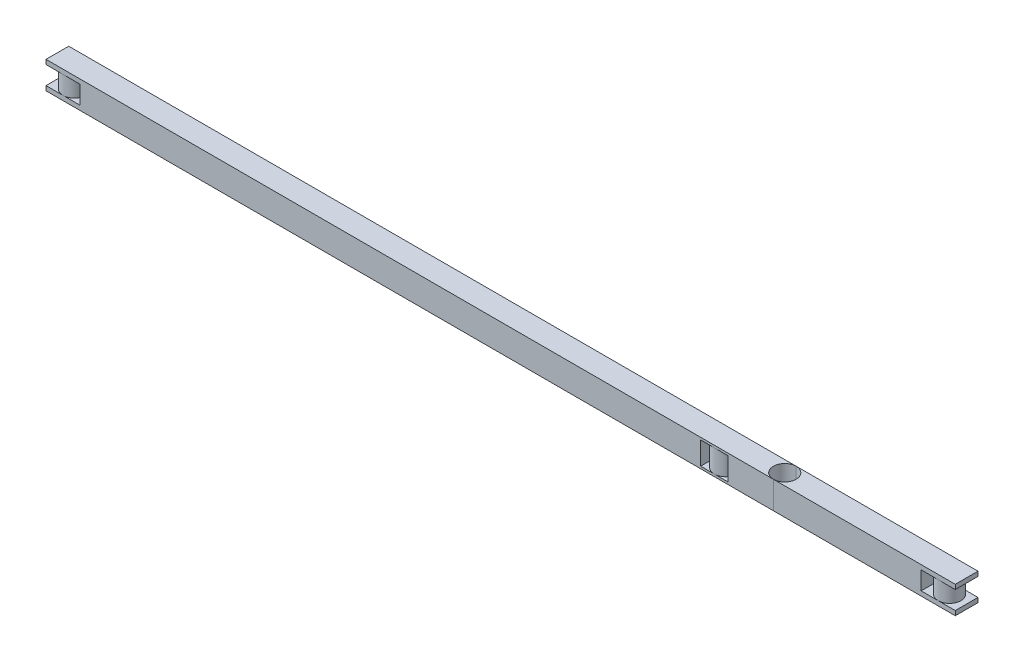
ISO-10303-21;
HEADER;
FILE_DESCRIPTION(('STEP AP214'),'2;1');
FILE_NAME('part.step','',(''),(''),'','','');
FILE_SCHEMA(('AUTOMOTIVE_DESIGN { 1 0 10303 214 1 1 1 1 }'));
ENDSEC;
DATA;
#1=APPLICATION_CONTEXT('core data for automotive mechanical design processes');
#2=APPLICATION_PROTOCOL_DEFINITION('international standard','automotive_design',2000,#1);
#3=PRODUCT_CONTEXT('',#1,'mechanical');
#4=PRODUCT('Part','Part','',(#3));
#5=PRODUCT_RELATED_PRODUCT_CATEGORY('part','',(#4));
#6=PRODUCT_DEFINITION_FORMATION('','',#4);
#7=PRODUCT_DEFINITION_CONTEXT('part definition',#1,'design');
#8=PRODUCT_DEFINITION('design','',#6,#7);
#9=PRODUCT_DEFINITION_SHAPE('','',#8);
#10=(LENGTH_UNIT() NAMED_UNIT(*) SI_UNIT(.MILLI.,.METRE.));
#11=(NAMED_UNIT(*) PLANE_ANGLE_UNIT() SI_UNIT($,.RADIAN.));
#12=(NAMED_UNIT(*) SI_UNIT($,.STERADIAN.) SOLID_ANGLE_UNIT());
#13=UNCERTAINTY_MEASURE_WITH_UNIT(LENGTH_MEASURE(1.E-05),#10,'distance_accuracy_value','');
#14=(GEOMETRIC_REPRESENTATION_CONTEXT(3) GLOBAL_UNCERTAINTY_ASSIGNED_CONTEXT((#13)) GLOBAL_UNIT_ASSIGNED_CONTEXT((#10,
#11,#12)) REPRESENTATION_CONTEXT('',''));
#15=CARTESIAN_POINT('',(0.,0.,0.));
#16=DIRECTION('',(0.,0.,1.));
#17=DIRECTION('',(1.,0.,0.));
#18=AXIS2_PLACEMENT_3D('',#15,#16,#17);
#19=CARTESIAN_POINT('',(0.,0.,5.));
#20=DIRECTION('',(0.,0.,1.));
#21=DIRECTION('',(1.,0.,0.));
#22=AXIS2_PLACEMENT_3D('',#19,#20,#21);
#23=PLANE('',#22);
#24=DIRECTION('',(0.,1.,0.));
#25=VECTOR('',#24,1.);
#26=CARTESIAN_POINT('',(150.,0.,5.));
#27=LINE('',#26,#25);
#28=CARTESIAN_POINT('',(150.,-5.5,5.));
#29=VERTEX_POINT('',#28);
#30=CARTESIAN_POINT('',(150.,-0.5,5.));
#31=VERTEX_POINT('',#30);
#32=EDGE_CURVE('E255',#29,#31,#27,.T.);
#33=ORIENTED_EDGE('',*,*,#32,.F.);
#34=DIRECTION('',(-1.,0.,0.));
#35=VECTOR('',#34,1.);
#36=CARTESIAN_POINT('',(0.,-5.5,5.));
#37=LINE('',#36,#35);
#38=CARTESIAN_POINT('',(147.,-5.5,5.));
#39=VERTEX_POINT('',#38);
#40=EDGE_CURVE('E262',#29,#39,#37,.T.);
#41=ORIENTED_EDGE('',*,*,#40,.T.);
#42=CARTESIAN_POINT('',(144.,-5.5,5.));
#43=VERTEX_POINT('',#42);
#44=EDGE_CURVE('E175',#39,#43,#37,.T.);
#45=ORIENTED_EDGE('',*,*,#44,.T.);
#46=DIRECTION('',(0.,-1.,0.));
#47=VECTOR('',#46,1.);
#48=CARTESIAN_POINT('',(144.,0.,5.));
#49=LINE('',#48,#47);
#50=CARTESIAN_POINT('',(144.,-0.5,5.));
#51=VERTEX_POINT('',#50);
#52=EDGE_CURVE('E259',#51,#43,#49,.T.);
#53=ORIENTED_EDGE('',*,*,#52,.F.);
#54=DIRECTION('',(-1.,0.,0.));
#55=VECTOR('',#54,1.);
#56=CARTESIAN_POINT('',(0.,-0.5,5.));
#57=LINE('',#56,#55);
#58=CARTESIAN_POINT('',(147.,-0.5,5.));
#59=VERTEX_POINT('',#58);
#60=EDGE_CURVE('E265',#59,#51,#57,.T.);
#61=ORIENTED_EDGE('',*,*,#60,.F.);
#62=EDGE_CURVE('E167',#31,#59,#57,.T.);
#63=ORIENTED_EDGE('',*,*,#62,.F.);
#64=EDGE_LOOP('',(#33,#41,#45,#53,#61,#63));
#65=FACE_BOUND('',#64,.T.);
#66=DIRECTION('',(-1.,0.,0.));
#67=VECTOR('',#66,1.);
#68=CARTESIAN_POINT('',(0.,-5.99999999999998,5.));
#69=LINE('',#68,#67);
#70=CARTESIAN_POINT('',(160.,-6.00000000000002,5.));
#71=VERTEX_POINT('',#70);
#72=CARTESIAN_POINT('',(0.,-5.99999999999998,5.));
#73=VERTEX_POINT('',#72);
#74=EDGE_CURVE('E207',#71,#73,#69,.T.);
#75=ORIENTED_EDGE('',*,*,#74,.F.);
#76=DIRECTION('',(0.,1.,0.));
#77=VECTOR('',#76,1.);
#78=CARTESIAN_POINT('',(160.,-6.00000000000004,5.));
#79=LINE('',#78,#77);
#80=CARTESIAN_POINT('',(160.,0.,5.));
#81=VERTEX_POINT('',#80);
#82=EDGE_CURVE('E69',#71,#81,#79,.T.);
#83=ORIENTED_EDGE('',*,*,#82,.T.);
#84=DIRECTION('',(1.,0.,0.));
#85=VECTOR('',#84,1.);
#86=CARTESIAN_POINT('',(0.,0.,5.));
#87=LINE('',#86,#85);
#88=CARTESIAN_POINT('',(0.,0.,5.));
#89=VERTEX_POINT('',#88);
#90=EDGE_CURVE('E210',#89,#81,#87,.T.);
#91=ORIENTED_EDGE('',*,*,#90,.F.);
#92=DIRECTION('',(0.,1.,0.));
#93=VECTOR('',#92,1.);
#94=CARTESIAN_POINT('',(0.,0.,5.));
#95=LINE('',#94,#93);
#96=CARTESIAN_POINT('',(0.,-1.,5.));
#97=VERTEX_POINT('',#96);
#98=EDGE_CURVE('E213',#97,#89,#95,.T.);
#99=ORIENTED_EDGE('',*,*,#98,.F.);
#100=DIRECTION('',(1.,0.,0.));
#101=VECTOR('',#100,1.);
#102=CARTESIAN_POINT('',(0.,-1.,5.));
#103=LINE('',#102,#101);
#104=CARTESIAN_POINT('',(3.75,-1.,5.));
#105=VERTEX_POINT('',#104);
#106=EDGE_CURVE('E203',#97,#105,#103,.T.);
#107=ORIENTED_EDGE('',*,*,#106,.T.);
#108=CARTESIAN_POINT('',(7.5,-1.,5.));
#109=VERTEX_POINT('',#108);
#110=EDGE_CURVE('E238',#105,#109,#103,.T.);
#111=ORIENTED_EDGE('',*,*,#110,.T.);
#112=DIRECTION('',(0.,-1.,0.));
#113=VECTOR('',#112,1.);
#114=CARTESIAN_POINT('',(7.5,0.,5.));
#115=LINE('',#114,#113);
#116=CARTESIAN_POINT('',(7.5,-4.99999999999998,5.));
#117=VERTEX_POINT('',#116);
#118=EDGE_CURVE('E236',#109,#117,#115,.T.);
#119=ORIENTED_EDGE('',*,*,#118,.T.);
#120=DIRECTION('',(-1.,0.,0.));
#121=VECTOR('',#120,1.);
#122=CARTESIAN_POINT('',(0.,-4.99999999999998,5.));
#123=LINE('',#122,#121);
#124=CARTESIAN_POINT('',(3.75,-4.99999999999998,5.));
#125=VERTEX_POINT('',#124);
#126=EDGE_CURVE('E232',#117,#125,#123,.T.);
#127=ORIENTED_EDGE('',*,*,#126,.T.);
#128=CARTESIAN_POINT('',(0.,-4.99999999999998,5.));
#129=VERTEX_POINT('',#128);
#130=EDGE_CURVE('E235',#125,#129,#123,.T.);
#131=ORIENTED_EDGE('',*,*,#130,.T.);
#132=EDGE_CURVE('E244',#73,#129,#95,.T.);
#133=ORIENTED_EDGE('',*,*,#132,.F.);
#134=EDGE_LOOP('',(#75,#83,#91,#99,#107,#111,#119,#127,#131,#133));
#135=FACE_BOUND('',#134,.T.);
#136=ADVANCED_FACE('F53',(#65,#135),#23,.T.);
#137=CARTESIAN_POINT('',(0.,0.,0.));
#138=DIRECTION('',(0.,0.,1.));
#139=DIRECTION('',(1.,0.,0.));
#140=AXIS2_PLACEMENT_3D('',#137,#138,#139);
#141=PLANE('',#140);
#142=DIRECTION('',(-1.,0.,0.));
#143=VECTOR('',#142,1.);
#144=CARTESIAN_POINT('',(150.,-5.5,0.));
#145=LINE('',#144,#143);
#146=CARTESIAN_POINT('',(150.,-5.5,0.));
#147=VERTEX_POINT('',#146);
#148=CARTESIAN_POINT('',(147.,-5.5,0.));
#149=VERTEX_POINT('',#148);
#150=EDGE_CURVE('E184',#147,#149,#145,.T.);
#151=ORIENTED_EDGE('',*,*,#150,.F.);
#152=DIRECTION('',(0.,1.,0.));
#153=VECTOR('',#152,1.);
#154=CARTESIAN_POINT('',(150.,-5.5,0.));
#155=LINE('',#154,#153);
#156=CARTESIAN_POINT('',(150.,-0.5,0.));
#157=VERTEX_POINT('',#156);
#158=EDGE_CURVE('E267',#147,#157,#155,.T.);
#159=ORIENTED_EDGE('',*,*,#158,.T.);
#160=DIRECTION('',(-1.,0.,0.));
#161=VECTOR('',#160,1.);
#162=CARTESIAN_POINT('',(150.,-0.5,0.));
#163=LINE('',#162,#161);
#164=CARTESIAN_POINT('',(147.,-0.5,0.));
#165=VERTEX_POINT('',#164);
#166=EDGE_CURVE('E269',#157,#165,#163,.T.);
#167=ORIENTED_EDGE('',*,*,#166,.T.);
#168=CARTESIAN_POINT('',(144.,-0.5,0.));
#169=VERTEX_POINT('',#168);
#170=EDGE_CURVE('E217',#165,#169,#163,.T.);
#171=ORIENTED_EDGE('',*,*,#170,.T.);
#172=DIRECTION('',(0.,1.,0.));
#173=VECTOR('',#172,1.);
#174=CARTESIAN_POINT('',(144.,-5.5,0.));
#175=LINE('',#174,#173);
#176=CARTESIAN_POINT('',(144.,-5.5,0.));
#177=VERTEX_POINT('',#176);
#178=EDGE_CURVE('E186',#177,#169,#175,.T.);
#179=ORIENTED_EDGE('',*,*,#178,.F.);
#180=EDGE_CURVE('E173',#149,#177,#145,.T.);
#181=ORIENTED_EDGE('',*,*,#180,.F.);
#182=EDGE_LOOP('',(#151,#159,#167,#171,#179,#181));
#183=FACE_BOUND('',#182,.T.);
#184=DIRECTION('',(0.,1.,0.));
#185=VECTOR('',#184,1.);
#186=CARTESIAN_POINT('',(160.,-6.00000000000004,0.));
#187=LINE('',#186,#185);
#188=CARTESIAN_POINT('',(160.,-6.00000000000004,0.));
#189=VERTEX_POINT('',#188);
#190=CARTESIAN_POINT('',(160.,0.,0.));
#191=VERTEX_POINT('',#190);
#192=EDGE_CURVE('E62',#189,#191,#187,.T.);
#193=ORIENTED_EDGE('',*,*,#192,.F.);
#194=DIRECTION('',(-1.,0.,0.));
#195=VECTOR('',#194,1.);
#196=CARTESIAN_POINT('',(0.,-5.99999999999998,0.));
#197=LINE('',#196,#195);
#198=CARTESIAN_POINT('',(0.,-5.99999999999998,0.));
#199=VERTEX_POINT('',#198);
#200=EDGE_CURVE('E215',#189,#199,#197,.T.);
#201=ORIENTED_EDGE('',*,*,#200,.T.);
#202=DIRECTION('',(0.,1.,0.));
#203=VECTOR('',#202,1.);
#204=CARTESIAN_POINT('',(0.,0.,0.));
#205=LINE('',#204,#203);
#206=CARTESIAN_POINT('',(0.,-4.99999999999998,0.));
#207=VERTEX_POINT('',#206);
#208=EDGE_CURVE('E216',#199,#207,#205,.T.);
#209=ORIENTED_EDGE('',*,*,#208,.T.);
#210=DIRECTION('',(-1.,0.,0.));
#211=VECTOR('',#210,1.);
#212=CARTESIAN_POINT('',(0.,-4.99999999999998,0.));
#213=LINE('',#212,#211);
#214=CARTESIAN_POINT('',(3.75,-4.99999999999998,0.));
#215=VERTEX_POINT('',#214);
#216=EDGE_CURVE('E214',#215,#207,#213,.T.);
#217=ORIENTED_EDGE('',*,*,#216,.F.);
#218=CARTESIAN_POINT('',(7.5,-4.99999999999998,0.));
#219=VERTEX_POINT('',#218);
#220=EDGE_CURVE('E249',#219,#215,#213,.T.);
#221=ORIENTED_EDGE('',*,*,#220,.F.);
#222=DIRECTION('',(0.,-1.,0.));
#223=VECTOR('',#222,1.);
#224=CARTESIAN_POINT('',(7.5,0.,0.));
#225=LINE('',#224,#223);
#226=CARTESIAN_POINT('',(7.5,-1.,0.));
#227=VERTEX_POINT('',#226);
#228=EDGE_CURVE('E294',#227,#219,#225,.T.);
#229=ORIENTED_EDGE('',*,*,#228,.F.);
#230=DIRECTION('',(1.,0.,0.));
#231=VECTOR('',#230,1.);
#232=CARTESIAN_POINT('',(0.,-1.,0.));
#233=LINE('',#232,#231);
#234=CARTESIAN_POINT('',(3.75,-1.,0.));
#235=VERTEX_POINT('',#234);
#236=EDGE_CURVE('E283',#235,#227,#233,.T.);
#237=ORIENTED_EDGE('',*,*,#236,.F.);
#238=CARTESIAN_POINT('',(0.,-1.,0.));
#239=VERTEX_POINT('',#238);
#240=EDGE_CURVE('E230',#239,#235,#233,.T.);
#241=ORIENTED_EDGE('',*,*,#240,.F.);
#242=CARTESIAN_POINT('',(0.,0.,0.));
#243=VERTEX_POINT('',#242);
#244=EDGE_CURVE('E219',#239,#243,#205,.T.);
#245=ORIENTED_EDGE('',*,*,#244,.T.);
#246=DIRECTION('',(1.,0.,0.));
#247=VECTOR('',#246,1.);
#248=CARTESIAN_POINT('',(0.,0.,0.));
#249=LINE('',#248,#247);
#250=EDGE_CURVE('E209',#243,#191,#249,.T.);
#251=ORIENTED_EDGE('',*,*,#250,.T.);
#252=EDGE_LOOP('',(#193,#201,#209,#217,#221,#229,#237,#241,#245,#251));
#253=FACE_BOUND('',#252,.T.);
#254=ADVANCED_FACE('F181',(#183,#253),#141,.F.);
#255=CARTESIAN_POINT('',(0.,-5.99999999999998,5.));
#256=DIRECTION('',(0.,-1.,0.));
#257=DIRECTION('',(1.,0.,0.));
#258=AXIS2_PLACEMENT_3D('',#255,#256,#257);
#259=PLANE('',#258);
#260=CARTESIAN_POINT('',(160.,-6.00000000000002,2.5));
#261=DIRECTION('',(0.,-1.,0.));
#262=DIRECTION('',(1.,0.,0.));
#263=AXIS2_PLACEMENT_3D('',#260,#261,#262);
#264=CIRCLE('',#263,2.5);
#265=EDGE_CURVE('E206',#71,#189,#264,.T.);
#266=ORIENTED_EDGE('',*,*,#265,.F.);
#267=ORIENTED_EDGE('',*,*,#74,.T.);
#268=DIRECTION('',(0.,0.,-1.));
#269=VECTOR('',#268,1.);
#270=CARTESIAN_POINT('',(0.,-5.99999999999998,5.));
#271=LINE('',#270,#269);
#272=EDGE_CURVE('E188',#73,#199,#271,.T.);
#273=ORIENTED_EDGE('',*,*,#272,.T.);
#274=ORIENTED_EDGE('',*,*,#200,.F.);
#275=EDGE_LOOP('',(#266,#267,#273,#274));
#276=FACE_BOUND('',#275,.T.);
#277=ADVANCED_FACE('F355',(#276),#259,.T.);
#278=CARTESIAN_POINT('',(0.,-5.5,0.));
#279=DIRECTION('',(0.,1.,0.));
#280=DIRECTION('',(0.,0.,1.));
#281=AXIS2_PLACEMENT_3D('',#278,#279,#280);
#282=PLANE('',#281);
#283=ORIENTED_EDGE('',*,*,#44,.F.);
#284=CARTESIAN_POINT('',(147.,-5.5,2.5));
#285=DIRECTION('',(0.,1.,0.));
#286=DIRECTION('',(0.,0.,1.));
#287=AXIS2_PLACEMENT_3D('',#284,#285,#286);
#288=CIRCLE('',#287,2.5);
#289=EDGE_CURVE('E163',#149,#39,#288,.T.);
#290=ORIENTED_EDGE('',*,*,#289,.F.);
#291=ORIENTED_EDGE('',*,*,#180,.T.);
#292=DIRECTION('',(0.,0.,1.));
#293=VECTOR('',#292,1.);
#294=CARTESIAN_POINT('',(144.,-5.5,0.));
#295=LINE('',#294,#293);
#296=EDGE_CURVE('E187',#177,#43,#295,.T.);
#297=ORIENTED_EDGE('',*,*,#296,.T.);
#298=EDGE_LOOP('',(#283,#290,#291,#297));
#299=FACE_BOUND('',#298,.T.);
#300=ADVANCED_FACE('F171',(#299),#282,.T.);
#301=CARTESIAN_POINT('',(0.,-0.5,0.));
#302=DIRECTION('',(0.,1.,0.));
#303=DIRECTION('',(0.,0.,1.));
#304=AXIS2_PLACEMENT_3D('',#301,#302,#303);
#305=PLANE('',#304);
#306=CARTESIAN_POINT('',(147.,-0.5,2.5));
#307=DIRECTION('',(0.,1.,0.));
#308=DIRECTION('',(0.,0.,1.));
#309=AXIS2_PLACEMENT_3D('',#306,#307,#308);
#310=CIRCLE('',#309,2.5);
#311=EDGE_CURVE('E177',#59,#165,#310,.F.);
#312=ORIENTED_EDGE('',*,*,#311,.F.);
#313=ORIENTED_EDGE('',*,*,#60,.T.);
#314=DIRECTION('',(0.,0.,1.));
#315=VECTOR('',#314,1.);
#316=CARTESIAN_POINT('',(144.,-0.5,0.));
#317=LINE('',#316,#315);
#318=EDGE_CURVE('E194',#169,#51,#317,.T.);
#319=ORIENTED_EDGE('',*,*,#318,.F.);
#320=ORIENTED_EDGE('',*,*,#170,.F.);
#321=EDGE_LOOP('',(#312,#313,#319,#320));
#322=FACE_BOUND('',#321,.T.);
#323=ADVANCED_FACE('F278',(#322),#305,.F.);
#324=CARTESIAN_POINT('',(0.,-1.,5.));
#325=DIRECTION('',(0.,1.,0.));
#326=DIRECTION('',(0.,0.,1.));
#327=AXIS2_PLACEMENT_3D('',#324,#325,#326);
#328=PLANE('',#327);
#329=ORIENTED_EDGE('',*,*,#110,.F.);
#330=CARTESIAN_POINT('',(3.75,-1.,2.5));
#331=DIRECTION('',(0.,1.,0.));
#332=DIRECTION('',(0.,0.,1.));
#333=AXIS2_PLACEMENT_3D('',#330,#331,#332);
#334=CIRCLE('',#333,2.5);
#335=EDGE_CURVE('E253',#235,#105,#334,.F.);
#336=ORIENTED_EDGE('',*,*,#335,.F.);
#337=ORIENTED_EDGE('',*,*,#236,.T.);
#338=DIRECTION('',(0.,0.,-1.));
#339=VECTOR('',#338,1.);
#340=CARTESIAN_POINT('',(7.5,-1.,5.));
#341=LINE('',#340,#339);
#342=EDGE_CURVE('E301',#109,#227,#341,.T.);
#343=ORIENTED_EDGE('',*,*,#342,.F.);
#344=EDGE_LOOP('',(#329,#336,#337,#343));
#345=FACE_BOUND('',#344,.T.);
#346=ADVANCED_FACE('F335',(#345),#328,.F.);
#347=CARTESIAN_POINT('',(0.,-4.99999999999998,5.));
#348=DIRECTION('',(0.,-1.,0.));
#349=DIRECTION('',(1.,0.,0.));
#350=AXIS2_PLACEMENT_3D('',#347,#348,#349);
#351=PLANE('',#350);
#352=ORIENTED_EDGE('',*,*,#130,.F.);
#353=CARTESIAN_POINT('',(3.75,-4.99999999999998,2.5));
#354=DIRECTION('',(0.,-1.,0.));
#355=DIRECTION('',(1.,0.,0.));
#356=AXIS2_PLACEMENT_3D('',#353,#354,#355);
#357=CIRCLE('',#356,2.5);
#358=EDGE_CURVE('E250',#125,#215,#357,.T.);
#359=ORIENTED_EDGE('',*,*,#358,.T.);
#360=ORIENTED_EDGE('',*,*,#216,.T.);
#361=DIRECTION('',(0.,0.,-1.));
#362=VECTOR('',#361,1.);
#363=CARTESIAN_POINT('',(0.,-4.99999999999998,5.));
#364=LINE('',#363,#362);
#365=EDGE_CURVE('E254',#129,#207,#364,.T.);
#366=ORIENTED_EDGE('',*,*,#365,.F.);
#367=EDGE_LOOP('',(#352,#359,#360,#366));
#368=FACE_BOUND('',#367,.T.);
#369=ADVANCED_FACE('F324',(#368),#351,.F.);
#370=CARTESIAN_POINT('',(0.,0.,5.));
#371=DIRECTION('',(0.,1.,0.));
#372=DIRECTION('',(0.,0.,1.));
#373=AXIS2_PLACEMENT_3D('',#370,#371,#372);
#374=PLANE('',#373);
#375=CARTESIAN_POINT('',(160.,0.,2.5));
#376=DIRECTION('',(0.,1.,0.));
#377=DIRECTION('',(0.,0.,1.));
#378=AXIS2_PLACEMENT_3D('',#375,#376,#377);
#379=CIRCLE('',#378,2.5);
#380=EDGE_CURVE('E12',#191,#81,#379,.T.);
#381=ORIENTED_EDGE('',*,*,#380,.F.);
#382=ORIENTED_EDGE('',*,*,#250,.F.);
#383=DIRECTION('',(0.,0.,-1.));
#384=VECTOR('',#383,1.);
#385=CARTESIAN_POINT('',(0.,0.,5.));
#386=LINE('',#385,#384);
#387=EDGE_CURVE('E243',#89,#243,#386,.T.);
#388=ORIENTED_EDGE('',*,*,#387,.F.);
#389=ORIENTED_EDGE('',*,*,#90,.T.);
#390=EDGE_LOOP('',(#381,#382,#388,#389));
#391=FACE_BOUND('',#390,.T.);
#392=ADVANCED_FACE('F343',(#391),#374,.T.);
#393=CARTESIAN_POINT('',(0.,0.,5.));
#394=DIRECTION('',(-1.,0.,0.));
#395=DIRECTION('',(0.,0.,1.));
#396=AXIS2_PLACEMENT_3D('',#393,#394,#395);
#397=PLANE('',#396);
#398=ORIENTED_EDGE('',*,*,#244,.F.);
#399=DIRECTION('',(0.,0.,-1.));
#400=VECTOR('',#399,1.);
#401=CARTESIAN_POINT('',(0.,-1.,5.));
#402=LINE('',#401,#400);
#403=EDGE_CURVE('E291',#97,#239,#402,.T.);
#404=ORIENTED_EDGE('',*,*,#403,.F.);
#405=ORIENTED_EDGE('',*,*,#98,.T.);
#406=ORIENTED_EDGE('',*,*,#387,.T.);
#407=EDGE_LOOP('',(#398,#404,#405,#406));
#408=FACE_BOUND('',#407,.T.);
#409=ADVANCED_FACE('F349',(#408),#397,.T.);
#410=ORIENTED_EDGE('',*,*,#240,.T.);
#411=EDGE_CURVE('E251',#105,#235,#334,.F.);
#412=ORIENTED_EDGE('',*,*,#411,.F.);
#413=ORIENTED_EDGE('',*,*,#106,.F.);
#414=ORIENTED_EDGE('',*,*,#403,.T.);
#415=EDGE_LOOP('',(#410,#412,#413,#414));
#416=FACE_BOUND('',#415,.T.);
#417=ADVANCED_FACE('F338',(#416),#328,.F.);
#418=CARTESIAN_POINT('',(7.5,0.,5.));
#419=DIRECTION('',(1.,0.,0.));
#420=DIRECTION('',(0.,1.,0.));
#421=AXIS2_PLACEMENT_3D('',#418,#419,#420);
#422=PLANE('',#421);
#423=ORIENTED_EDGE('',*,*,#228,.T.);
#424=DIRECTION('',(0.,0.,-1.));
#425=VECTOR('',#424,1.);
#426=CARTESIAN_POINT('',(7.5,-4.99999999999998,5.));
#427=LINE('',#426,#425);
#428=EDGE_CURVE('E248',#117,#219,#427,.T.);
#429=ORIENTED_EDGE('',*,*,#428,.F.);
#430=ORIENTED_EDGE('',*,*,#118,.F.);
#431=ORIENTED_EDGE('',*,*,#342,.T.);
#432=EDGE_LOOP('',(#423,#429,#430,#431));
#433=FACE_BOUND('',#432,.T.);
#434=ADVANCED_FACE('F313',(#433),#422,.F.);
#435=ORIENTED_EDGE('',*,*,#220,.T.);
#436=EDGE_CURVE('E245',#215,#125,#357,.T.);
#437=ORIENTED_EDGE('',*,*,#436,.T.);
#438=ORIENTED_EDGE('',*,*,#126,.F.);
#439=ORIENTED_EDGE('',*,*,#428,.T.);
#440=EDGE_LOOP('',(#435,#437,#438,#439));
#441=FACE_BOUND('',#440,.T.);
#442=ADVANCED_FACE('F318',(#441),#351,.F.);
#443=ORIENTED_EDGE('',*,*,#208,.F.);
#444=ORIENTED_EDGE('',*,*,#272,.F.);
#445=ORIENTED_EDGE('',*,*,#132,.T.);
#446=ORIENTED_EDGE('',*,*,#365,.T.);
#447=EDGE_LOOP('',(#443,#444,#445,#446));
#448=FACE_BOUND('',#447,.T.);
#449=ADVANCED_FACE('F327',(#448),#397,.T.);
#450=CARTESIAN_POINT('',(3.75,6.07106781186548,2.5));
#451=DIRECTION('',(0.,-1.,0.));
#452=DIRECTION('',(0.,0.,-1.));
#453=AXIS2_PLACEMENT_3D('',#450,#451,#452);
#454=CYLINDRICAL_SURFACE('',#453,2.5);
#455=ORIENTED_EDGE('',*,*,#411,.T.);
#456=ORIENTED_EDGE('',*,*,#335,.T.);
#457=EDGE_LOOP('',(#455,#456));
#458=FACE_BOUND('',#457,.T.);
#459=ORIENTED_EDGE('',*,*,#358,.F.);
#460=ORIENTED_EDGE('',*,*,#436,.F.);
#461=EDGE_LOOP('',(#459,#460));
#462=FACE_BOUND('',#461,.T.);
#463=ADVANCED_FACE('F374',(#458,#462),#454,.T.);
#464=CARTESIAN_POINT('',(150.,-5.5,6.));
#465=DIRECTION('',(1.,0.,0.));
#466=DIRECTION('',(0.,0.,-1.));
#467=AXIS2_PLACEMENT_3D('',#464,#465,#466);
#468=PLANE('',#467);
#469=ORIENTED_EDGE('',*,*,#32,.T.);
#470=DIRECTION('',(0.,0.,-1.));
#471=VECTOR('',#470,1.);
#472=CARTESIAN_POINT('',(150.,-0.5,6.));
#473=LINE('',#472,#471);
#474=EDGE_CURVE('E258',#31,#157,#473,.T.);
#475=ORIENTED_EDGE('',*,*,#474,.T.);
#476=ORIENTED_EDGE('',*,*,#158,.F.);
#477=DIRECTION('',(0.,0.,-1.));
#478=VECTOR('',#477,1.);
#479=CARTESIAN_POINT('',(150.,-5.5,6.));
#480=LINE('',#479,#478);
#481=EDGE_CURVE('E192',#29,#147,#480,.T.);
#482=ORIENTED_EDGE('',*,*,#481,.F.);
#483=EDGE_LOOP('',(#469,#475,#476,#482));
#484=FACE_BOUND('',#483,.T.);
#485=ADVANCED_FACE('F371',(#484),#468,.F.);
#486=CARTESIAN_POINT('',(144.,-5.5,0.));
#487=DIRECTION('',(-1.,0.,0.));
#488=DIRECTION('',(0.,0.,1.));
#489=AXIS2_PLACEMENT_3D('',#486,#487,#488);
#490=PLANE('',#489);
#491=ORIENTED_EDGE('',*,*,#52,.T.);
#492=ORIENTED_EDGE('',*,*,#296,.F.);
#493=ORIENTED_EDGE('',*,*,#178,.T.);
#494=ORIENTED_EDGE('',*,*,#318,.T.);
#495=EDGE_LOOP('',(#491,#492,#493,#494));
#496=FACE_BOUND('',#495,.T.);
#497=ADVANCED_FACE('F282',(#496),#490,.F.);
#498=ORIENTED_EDGE('',*,*,#150,.T.);
#499=EDGE_CURVE('E159',#39,#149,#288,.T.);
#500=ORIENTED_EDGE('',*,*,#499,.F.);
#501=ORIENTED_EDGE('',*,*,#40,.F.);
#502=ORIENTED_EDGE('',*,*,#481,.T.);
#503=EDGE_LOOP('',(#498,#500,#501,#502));
#504=FACE_BOUND('',#503,.T.);
#505=ADVANCED_FACE('F190',(#504),#282,.T.);
#506=CARTESIAN_POINT('',(147.,-0.5,2.5));
#507=DIRECTION('',(0.,1.,0.));
#508=DIRECTION('',(0.,0.,1.));
#509=AXIS2_PLACEMENT_3D('',#506,#507,#508);
#510=CIRCLE('',#509,2.5);
#511=EDGE_CURVE('E195',#59,#165,#510,.T.);
#512=ORIENTED_EDGE('',*,*,#511,.T.);
#513=ORIENTED_EDGE('',*,*,#166,.F.);
#514=ORIENTED_EDGE('',*,*,#474,.F.);
#515=ORIENTED_EDGE('',*,*,#62,.T.);
#516=EDGE_LOOP('',(#512,#513,#514,#515));
#517=FACE_BOUND('',#516,.T.);
#518=ADVANCED_FACE('F346',(#517),#305,.F.);
#519=CARTESIAN_POINT('',(147.,0.00200000000000027,2.5));
#520=DIRECTION('',(0.,-1.,0.));
#521=DIRECTION('',(0.,0.,-1.));
#522=AXIS2_PLACEMENT_3D('',#519,#520,#521);
#523=CYLINDRICAL_SURFACE('',#522,2.5);
#524=ORIENTED_EDGE('',*,*,#499,.T.);
#525=ORIENTED_EDGE('',*,*,#289,.T.);
#526=EDGE_LOOP('',(#524,#525));
#527=FACE_BOUND('',#526,.T.);
#528=ORIENTED_EDGE('',*,*,#511,.F.);
#529=ORIENTED_EDGE('',*,*,#311,.T.);
#530=EDGE_LOOP('',(#528,#529));
#531=FACE_BOUND('',#530,.T.);
#532=ADVANCED_FACE('F161',(#527,#531),#523,.T.);
#533=CARTESIAN_POINT('',(160.,-6.00000000000004,2.5));
#534=DIRECTION('',(0.,1.,0.));
#535=DIRECTION('',(0.,0.,1.));
#536=AXIS2_PLACEMENT_3D('',#533,#534,#535);
#537=CYLINDRICAL_SURFACE('',#536,2.5);
#538=ORIENTED_EDGE('',*,*,#265,.T.);
#539=ORIENTED_EDGE('',*,*,#192,.T.);
#540=ORIENTED_EDGE('',*,*,#380,.T.);
#541=ORIENTED_EDGE('',*,*,#82,.F.);
#542=EDGE_LOOP('',(#538,#539,#540,#541));
#543=FACE_BOUND('',#542,.T.);
#544=ADVANCED_FACE('F55',(#543),#537,.F.);
#545=CLOSED_SHELL('',(#136,#254,#277,#300,#323,#346,#369,#392,#409,#417,#434,#442,#449,#463,
#485,#497,#505,#518,#532,#544));
#546=MANIFOLD_SOLID_BREP('B2',#545);
#547=CARTESIAN_POINT('',(196.25,-12.0710678118655,2.5));
#548=DIRECTION('',(0.,1.,0.));
#549=DIRECTION('',(0.,0.,1.));
#550=AXIS2_PLACEMENT_3D('',#547,#548,#549);
#551=CYLINDRICAL_SURFACE('',#550,2.5);
#552=CARTESIAN_POINT('',(196.25,-5.00000000000003,2.5));
#553=DIRECTION('',(0.,1.,0.));
#554=DIRECTION('',(0.,0.,1.));
#555=AXIS2_PLACEMENT_3D('',#552,#553,#554);
#556=CIRCLE('',#555,2.5);
#557=CARTESIAN_POINT('',(196.25,-5.00000000000003,5.));
#558=VERTEX_POINT('',#557);
#559=CARTESIAN_POINT('',(196.25,-5.00000000000003,0.));
#560=VERTEX_POINT('',#559);
#561=EDGE_CURVE('E650',#558,#560,#556,.F.);
#562=ORIENTED_EDGE('',*,*,#561,.F.);
#563=EDGE_CURVE('E589',#560,#558,#556,.F.);
#564=ORIENTED_EDGE('',*,*,#563,.F.);
#565=EDGE_LOOP('',(#562,#564));
#566=FACE_BOUND('',#565,.T.);
#567=CARTESIAN_POINT('',(196.25,-1.,2.5));
#568=DIRECTION('',(0.,-1.,0.));
#569=DIRECTION('',(1.,0.,0.));
#570=AXIS2_PLACEMENT_3D('',#567,#568,#569);
#571=CIRCLE('',#570,2.5);
#572=CARTESIAN_POINT('',(196.25,-1.,0.));
#573=VERTEX_POINT('',#572);
#574=CARTESIAN_POINT('',(196.25,-1.,5.));
#575=VERTEX_POINT('',#574);
#576=EDGE_CURVE('E652',#573,#575,#571,.T.);
#577=ORIENTED_EDGE('',*,*,#576,.T.);
#578=EDGE_CURVE('E655',#575,#573,#571,.T.);
#579=ORIENTED_EDGE('',*,*,#578,.T.);
#580=EDGE_LOOP('',(#577,#579));
#581=FACE_BOUND('',#580,.T.);
#582=ADVANCED_FACE('F511',(#566,#581),#551,.T.);
#583=CARTESIAN_POINT('',(0.,-5.00000000000003,5.));
#584=DIRECTION('',(0.,1.,0.));
#585=DIRECTION('',(0.,0.,1.));
#586=AXIS2_PLACEMENT_3D('',#583,#584,#585);
#587=PLANE('',#586);
#588=ORIENTED_EDGE('',*,*,#563,.T.);
#589=DIRECTION('',(1.,0.,0.));
#590=VECTOR('',#589,1.);
#591=CARTESIAN_POINT('',(0.,-5.00000000000003,5.));
#592=LINE('',#591,#590);
#593=CARTESIAN_POINT('',(200.,-5.00000000000003,5.));
#594=VERTEX_POINT('',#593);
#595=EDGE_CURVE('E659',#558,#594,#592,.T.);
#596=ORIENTED_EDGE('',*,*,#595,.T.);
#597=DIRECTION('',(0.,0.,-1.));
#598=VECTOR('',#597,1.);
#599=CARTESIAN_POINT('',(200.,-5.00000000000003,5.));
#600=LINE('',#599,#598);
#601=CARTESIAN_POINT('',(200.,-5.00000000000003,0.));
#602=VERTEX_POINT('',#601);
#603=EDGE_CURVE('E605',#594,#602,#600,.T.);
#604=ORIENTED_EDGE('',*,*,#603,.T.);
#605=DIRECTION('',(1.,0.,0.));
#606=VECTOR('',#605,1.);
#607=CARTESIAN_POINT('',(0.,-5.00000000000003,0.));
#608=LINE('',#607,#606);
#609=EDGE_CURVE('E614',#560,#602,#608,.T.);
#610=ORIENTED_EDGE('',*,*,#609,.F.);
#611=EDGE_LOOP('',(#588,#596,#604,#610));
#612=FACE_BOUND('',#611,.T.);
#613=ADVANCED_FACE('F691',(#612),#587,.T.);
#614=ORIENTED_EDGE('',*,*,#561,.T.);
#615=CARTESIAN_POINT('',(192.5,-5.00000000000003,0.));
#616=VERTEX_POINT('',#615);
#617=EDGE_CURVE('E610',#616,#560,#608,.T.);
#618=ORIENTED_EDGE('',*,*,#617,.F.);
#619=DIRECTION('',(0.,0.,-1.));
#620=VECTOR('',#619,1.);
#621=CARTESIAN_POINT('',(192.5,-5.00000000000003,5.));
#622=LINE('',#621,#620);
#623=CARTESIAN_POINT('',(192.5,-5.00000000000003,5.));
#624=VERTEX_POINT('',#623);
#625=EDGE_CURVE('E515',#624,#616,#622,.T.);
#626=ORIENTED_EDGE('',*,*,#625,.F.);
#627=EDGE_CURVE('E656',#624,#558,#592,.T.);
#628=ORIENTED_EDGE('',*,*,#627,.T.);
#629=EDGE_LOOP('',(#614,#618,#626,#628));
#630=FACE_BOUND('',#629,.T.);
#631=ADVANCED_FACE('F513',(#630),#587,.T.);
#632=CARTESIAN_POINT('',(192.5,0.,5.));
#633=DIRECTION('',(1.,0.,0.));
#634=DIRECTION('',(0.,0.,-1.));
#635=AXIS2_PLACEMENT_3D('',#632,#633,#634);
#636=PLANE('',#635);
#637=DIRECTION('',(0.,-1.,0.));
#638=VECTOR('',#637,1.);
#639=CARTESIAN_POINT('',(192.5,0.,0.));
#640=LINE('',#639,#638);
#641=CARTESIAN_POINT('',(192.5,-1.,0.));
#642=VERTEX_POINT('',#641);
#643=EDGE_CURVE('E613',#642,#616,#640,.T.);
#644=ORIENTED_EDGE('',*,*,#643,.F.);
#645=DIRECTION('',(0.,0.,-1.));
#646=VECTOR('',#645,1.);
#647=CARTESIAN_POINT('',(192.5,-1.,5.));
#648=LINE('',#647,#646);
#649=CARTESIAN_POINT('',(192.5,-1.,5.));
#650=VERTEX_POINT('',#649);
#651=EDGE_CURVE('E636',#650,#642,#648,.T.);
#652=ORIENTED_EDGE('',*,*,#651,.F.);
#653=DIRECTION('',(0.,-1.,0.));
#654=VECTOR('',#653,1.);
#655=CARTESIAN_POINT('',(192.5,0.,5.));
#656=LINE('',#655,#654);
#657=EDGE_CURVE('E658',#650,#624,#656,.T.);
#658=ORIENTED_EDGE('',*,*,#657,.T.);
#659=ORIENTED_EDGE('',*,*,#625,.T.);
#660=EDGE_LOOP('',(#644,#652,#658,#659));
#661=FACE_BOUND('',#660,.T.);
#662=ADVANCED_FACE('F747',(#661),#636,.T.);
#663=CARTESIAN_POINT('',(0.,-1.00000000000002,5.));
#664=DIRECTION('',(0.,-1.,0.));
#665=DIRECTION('',(1.,0.,0.));
#666=AXIS2_PLACEMENT_3D('',#663,#664,#665);
#667=PLANE('',#666);
#668=ORIENTED_EDGE('',*,*,#578,.F.);
#669=DIRECTION('',(-1.,0.,0.));
#670=VECTOR('',#669,1.);
#671=CARTESIAN_POINT('',(0.,-1.00000000000002,5.));
#672=LINE('',#671,#670);
#673=EDGE_CURVE('E661',#575,#650,#672,.T.);
#674=ORIENTED_EDGE('',*,*,#673,.T.);
#675=ORIENTED_EDGE('',*,*,#651,.T.);
#676=DIRECTION('',(-1.,0.,0.));
#677=VECTOR('',#676,1.);
#678=CARTESIAN_POINT('',(0.,-1.00000000000002,0.));
#679=LINE('',#678,#677);
#680=EDGE_CURVE('E617',#573,#642,#679,.T.);
#681=ORIENTED_EDGE('',*,*,#680,.F.);
#682=EDGE_LOOP('',(#668,#674,#675,#681));
#683=FACE_BOUND('',#682,.T.);
#684=ADVANCED_FACE('F742',(#683),#667,.T.);
#685=ORIENTED_EDGE('',*,*,#576,.F.);
#686=CARTESIAN_POINT('',(200.,-1.,0.));
#687=VERTEX_POINT('',#686);
#688=EDGE_CURVE('E618',#687,#573,#679,.T.);
#689=ORIENTED_EDGE('',*,*,#688,.F.);
#690=DIRECTION('',(0.,0.,-1.));
#691=VECTOR('',#690,1.);
#692=CARTESIAN_POINT('',(200.,-1.,5.));
#693=LINE('',#692,#691);
#694=CARTESIAN_POINT('',(200.,-1.,5.));
#695=VERTEX_POINT('',#694);
#696=EDGE_CURVE('E635',#695,#687,#693,.T.);
#697=ORIENTED_EDGE('',*,*,#696,.F.);
#698=EDGE_CURVE('E662',#695,#575,#672,.T.);
#699=ORIENTED_EDGE('',*,*,#698,.T.);
#700=EDGE_LOOP('',(#685,#689,#697,#699));
#701=FACE_BOUND('',#700,.T.);
#702=ADVANCED_FACE('F674',(#701),#667,.T.);
#703=CARTESIAN_POINT('',(200.,0.,5.));
#704=DIRECTION('',(1.,0.,0.));
#705=DIRECTION('',(0.,0.,-1.));
#706=AXIS2_PLACEMENT_3D('',#703,#704,#705);
#707=PLANE('',#706);
#708=DIRECTION('',(0.,-1.,0.));
#709=VECTOR('',#708,1.);
#710=CARTESIAN_POINT('',(200.,0.,0.));
#711=LINE('',#710,#709);
#712=CARTESIAN_POINT('',(200.,0.,0.));
#713=VERTEX_POINT('',#712);
#714=EDGE_CURVE('E621',#713,#687,#711,.T.);
#715=ORIENTED_EDGE('',*,*,#714,.F.);
#716=DIRECTION('',(0.,0.,-1.));
#717=VECTOR('',#716,1.);
#718=CARTESIAN_POINT('',(200.,0.,5.));
#719=LINE('',#718,#717);
#720=CARTESIAN_POINT('',(200.,0.,5.));
#721=VERTEX_POINT('',#720);
#722=EDGE_CURVE('E632',#721,#713,#719,.T.);
#723=ORIENTED_EDGE('',*,*,#722,.F.);
#724=DIRECTION('',(0.,-1.,0.));
#725=VECTOR('',#724,1.);
#726=CARTESIAN_POINT('',(200.,0.,5.));
#727=LINE('',#726,#725);
#728=EDGE_CURVE('E607',#721,#695,#727,.T.);
#729=ORIENTED_EDGE('',*,*,#728,.T.);
#730=ORIENTED_EDGE('',*,*,#696,.T.);
#731=EDGE_LOOP('',(#715,#723,#729,#730));
#732=FACE_BOUND('',#731,.T.);
#733=ADVANCED_FACE('F667',(#732),#707,.T.);
#734=CARTESIAN_POINT('',(200.,-6.00000000000004,0.));
#735=VERTEX_POINT('',#734);
#736=EDGE_CURVE('E625',#602,#735,#711,.T.);
#737=ORIENTED_EDGE('',*,*,#736,.F.);
#738=ORIENTED_EDGE('',*,*,#603,.F.);
#739=CARTESIAN_POINT('',(200.,-6.00000000000004,5.));
#740=VERTEX_POINT('',#739);
#741=EDGE_CURVE('E603',#594,#740,#727,.T.);
#742=ORIENTED_EDGE('',*,*,#741,.T.);
#743=DIRECTION('',(0.,0.,-1.));
#744=VECTOR('',#743,1.);
#745=CARTESIAN_POINT('',(200.,-6.00000000000004,5.));
#746=LINE('',#745,#744);
#747=EDGE_CURVE('E602',#740,#735,#746,.T.);
#748=ORIENTED_EDGE('',*,*,#747,.T.);
#749=EDGE_LOOP('',(#737,#738,#742,#748));
#750=FACE_BOUND('',#749,.T.);
#751=ADVANCED_FACE('F680',(#750),#707,.T.);
#752=CARTESIAN_POINT('',(0.,0.,5.));
#753=DIRECTION('',(0.,1.,0.));
#754=DIRECTION('',(0.,0.,1.));
#755=AXIS2_PLACEMENT_3D('',#752,#753,#754);
#756=PLANE('',#755);
#757=CARTESIAN_POINT('',(160.,0.,2.5));
#758=DIRECTION('',(0.,1.,0.));
#759=DIRECTION('',(0.,0.,1.));
#760=AXIS2_PLACEMENT_3D('',#757,#758,#759);
#761=CIRCLE('',#760,2.5);
#762=CARTESIAN_POINT('',(160.,0.,5.));
#763=VERTEX_POINT('',#762);
#764=CARTESIAN_POINT('',(160.,0.,0.));
#765=VERTEX_POINT('',#764);
#766=EDGE_CURVE('E590',#763,#765,#761,.T.);
#767=ORIENTED_EDGE('',*,*,#766,.F.);
#768=DIRECTION('',(1.,0.,0.));
#769=VECTOR('',#768,1.);
#770=CARTESIAN_POINT('',(0.,0.,5.));
#771=LINE('',#770,#769);
#772=EDGE_CURVE('E599',#763,#721,#771,.T.);
#773=ORIENTED_EDGE('',*,*,#772,.T.);
#774=ORIENTED_EDGE('',*,*,#722,.T.);
#775=DIRECTION('',(1.,0.,0.));
#776=VECTOR('',#775,1.);
#777=CARTESIAN_POINT('',(0.,0.,0.));
#778=LINE('',#777,#776);
#779=EDGE_CURVE('E624',#765,#713,#778,.T.);
#780=ORIENTED_EDGE('',*,*,#779,.F.);
#781=EDGE_LOOP('',(#767,#773,#774,#780));
#782=FACE_BOUND('',#781,.T.);
#783=ADVANCED_FACE('F678',(#782),#756,.T.);
#784=CARTESIAN_POINT('',(0.,-5.99999999999998,5.));
#785=DIRECTION('',(0.,-1.,0.));
#786=DIRECTION('',(1.,0.,0.));
#787=AXIS2_PLACEMENT_3D('',#784,#785,#786);
#788=PLANE('',#787);
#789=CARTESIAN_POINT('',(160.,-6.00000000000004,2.5));
#790=DIRECTION('',(0.,1.,0.));
#791=DIRECTION('',(0.,0.,1.));
#792=AXIS2_PLACEMENT_3D('',#789,#790,#791);
#793=CIRCLE('',#792,2.5);
#794=CARTESIAN_POINT('',(160.,-6.00000000000004,5.));
#795=VERTEX_POINT('',#794);
#796=CARTESIAN_POINT('',(160.,-6.00000000000002,0.));
#797=VERTEX_POINT('',#796);
#798=EDGE_CURVE('E584',#795,#797,#793,.T.);
#799=ORIENTED_EDGE('',*,*,#798,.T.);
#800=DIRECTION('',(-1.,0.,0.));
#801=VECTOR('',#800,1.);
#802=CARTESIAN_POINT('',(0.,-5.99999999999998,0.));
#803=LINE('',#802,#801);
#804=EDGE_CURVE('E627',#735,#797,#803,.T.);
#805=ORIENTED_EDGE('',*,*,#804,.F.);
#806=ORIENTED_EDGE('',*,*,#747,.F.);
#807=DIRECTION('',(-1.,0.,0.));
#808=VECTOR('',#807,1.);
#809=CARTESIAN_POINT('',(0.,-5.99999999999998,5.));
#810=LINE('',#809,#808);
#811=EDGE_CURVE('E596',#740,#795,#810,.T.);
#812=ORIENTED_EDGE('',*,*,#811,.T.);
#813=EDGE_LOOP('',(#799,#805,#806,#812));
#814=FACE_BOUND('',#813,.T.);
#815=ADVANCED_FACE('F601',(#814),#788,.T.);
#816=CARTESIAN_POINT('',(0.,0.,0.));
#817=DIRECTION('',(0.,0.,1.));
#818=DIRECTION('',(1.,0.,0.));
#819=AXIS2_PLACEMENT_3D('',#816,#817,#818);
#820=PLANE('',#819);
#821=ORIENTED_EDGE('',*,*,#804,.T.);
#822=DIRECTION('',(0.,1.,0.));
#823=VECTOR('',#822,1.);
#824=CARTESIAN_POINT('',(160.,-6.00000000000004,0.));
#825=LINE('',#824,#823);
#826=EDGE_CURVE('E520',#797,#765,#825,.T.);
#827=ORIENTED_EDGE('',*,*,#826,.T.);
#828=ORIENTED_EDGE('',*,*,#779,.T.);
#829=ORIENTED_EDGE('',*,*,#714,.T.);
#830=ORIENTED_EDGE('',*,*,#688,.T.);
#831=ORIENTED_EDGE('',*,*,#680,.T.);
#832=ORIENTED_EDGE('',*,*,#643,.T.);
#833=ORIENTED_EDGE('',*,*,#617,.T.);
#834=ORIENTED_EDGE('',*,*,#609,.T.);
#835=ORIENTED_EDGE('',*,*,#736,.T.);
#836=EDGE_LOOP('',(#821,#827,#828,#829,#830,#831,#832,#833,#834,#835));
#837=FACE_BOUND('',#836,.T.);
#838=ADVANCED_FACE('F676',(#837),#820,.F.);
#839=CARTESIAN_POINT('',(0.,0.,5.));
#840=DIRECTION('',(0.,0.,1.));
#841=DIRECTION('',(1.,0.,0.));
#842=AXIS2_PLACEMENT_3D('',#839,#840,#841);
#843=PLANE('',#842);
#844=DIRECTION('',(0.,1.,0.));
#845=VECTOR('',#844,1.);
#846=CARTESIAN_POINT('',(160.,-6.00000000000004,5.));
#847=LINE('',#846,#845);
#848=EDGE_CURVE('E51',#795,#763,#847,.T.);
#849=ORIENTED_EDGE('',*,*,#848,.F.);
#850=ORIENTED_EDGE('',*,*,#811,.F.);
#851=ORIENTED_EDGE('',*,*,#741,.F.);
#852=ORIENTED_EDGE('',*,*,#595,.F.);
#853=ORIENTED_EDGE('',*,*,#627,.F.);
#854=ORIENTED_EDGE('',*,*,#657,.F.);
#855=ORIENTED_EDGE('',*,*,#673,.F.);
#856=ORIENTED_EDGE('',*,*,#698,.F.);
#857=ORIENTED_EDGE('',*,*,#728,.F.);
#858=ORIENTED_EDGE('',*,*,#772,.F.);
#859=EDGE_LOOP('',(#849,#850,#851,#852,#853,#854,#855,#856,#857,#858));
#860=FACE_BOUND('',#859,.T.);
#861=ADVANCED_FACE('F594',(#860),#843,.T.);
#862=CARTESIAN_POINT('',(160.,-6.00000000000004,2.5));
#863=DIRECTION('',(0.,1.,0.));
#864=DIRECTION('',(0.,0.,1.));
#865=AXIS2_PLACEMENT_3D('',#862,#863,#864);
#866=CYLINDRICAL_SURFACE('',#865,2.5);
#867=ORIENTED_EDGE('',*,*,#848,.T.);
#868=ORIENTED_EDGE('',*,*,#766,.T.);
#869=ORIENTED_EDGE('',*,*,#826,.F.);
#870=ORIENTED_EDGE('',*,*,#798,.F.);
#871=EDGE_LOOP('',(#867,#868,#869,#870));
#872=FACE_BOUND('',#871,.T.);
#873=ADVANCED_FACE('F585',(#872),#866,.F.);
#874=CLOSED_SHELL('',(#582,#613,#631,#662,#684,#702,#733,#751,#783,#815,#838,#861,#873));
#875=MANIFOLD_SOLID_BREP('B6',#874);
#876=ADVANCED_BREP_SHAPE_REPRESENTATION('',(#18,#546,#875),#14);
#877=SHAPE_DEFINITION_REPRESENTATION(#9,#876);
ENDSEC;
END-ISO-10303-21;
